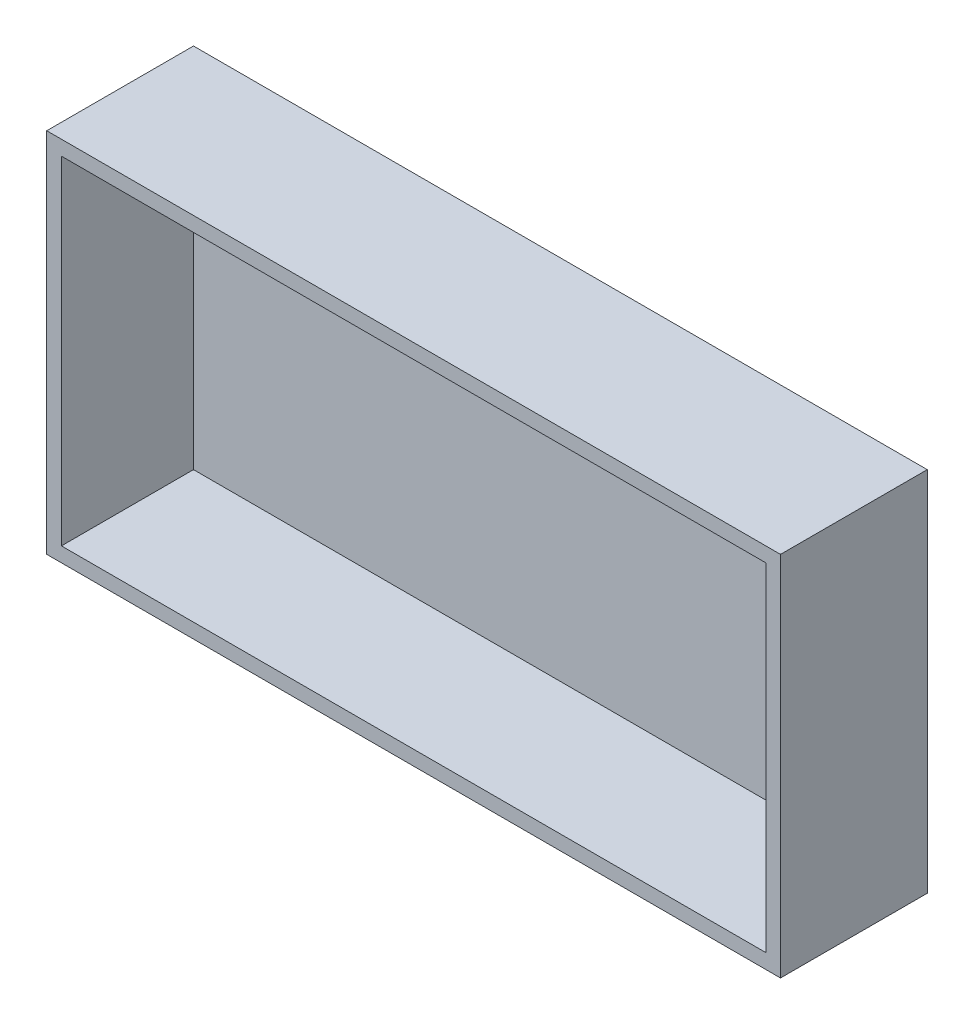
ISO-10303-21;
HEADER;
FILE_DESCRIPTION(('STEP AP214'),'2;1');
FILE_NAME('part.step','',(''),(''),'','','');
FILE_SCHEMA(('AUTOMOTIVE_DESIGN { 1 0 10303 214 1 1 1 1 }'));
ENDSEC;
DATA;
#1=APPLICATION_CONTEXT('core data for automotive mechanical design processes');
#2=APPLICATION_PROTOCOL_DEFINITION('international standard','automotive_design',2000,#1);
#3=PRODUCT_CONTEXT('',#1,'mechanical');
#4=PRODUCT('Part','Part','',(#3));
#5=PRODUCT_RELATED_PRODUCT_CATEGORY('part','',(#4));
#6=PRODUCT_DEFINITION_FORMATION('','',#4);
#7=PRODUCT_DEFINITION_CONTEXT('part definition',#1,'design');
#8=PRODUCT_DEFINITION('design','',#6,#7);
#9=PRODUCT_DEFINITION_SHAPE('','',#8);
#10=(LENGTH_UNIT() NAMED_UNIT(*) SI_UNIT(.MILLI.,.METRE.));
#11=(NAMED_UNIT(*) PLANE_ANGLE_UNIT() SI_UNIT($,.RADIAN.));
#12=(NAMED_UNIT(*) SI_UNIT($,.STERADIAN.) SOLID_ANGLE_UNIT());
#13=UNCERTAINTY_MEASURE_WITH_UNIT(LENGTH_MEASURE(1.E-05),#10,'distance_accuracy_value','');
#14=(GEOMETRIC_REPRESENTATION_CONTEXT(3) GLOBAL_UNCERTAINTY_ASSIGNED_CONTEXT((#13)) GLOBAL_UNIT_ASSIGNED_CONTEXT((#10,
#11,#12)) REPRESENTATION_CONTEXT('',''));
#15=CARTESIAN_POINT('',(0.,0.,0.));
#16=DIRECTION('',(0.,0.,1.));
#17=DIRECTION('',(1.,0.,0.));
#18=AXIS2_PLACEMENT_3D('',#15,#16,#17);
#19=CARTESIAN_POINT('',(3.,55.,20.));
#20=DIRECTION('',(1.,0.,0.));
#21=DIRECTION('',(0.,0.,-1.));
#22=AXIS2_PLACEMENT_3D('',#19,#20,#21);
#23=PLANE('',#22);
#24=DIRECTION('',(0.,-1.,0.));
#25=VECTOR('',#24,1.);
#26=CARTESIAN_POINT('',(3.,55.,0.));
#27=LINE('',#26,#25);
#28=CARTESIAN_POINT('',(3.,55.,0.));
#29=VERTEX_POINT('',#28);
#30=CARTESIAN_POINT('',(3.,5.,0.));
#31=VERTEX_POINT('',#30);
#32=EDGE_CURVE('E155',#29,#31,#27,.T.);
#33=ORIENTED_EDGE('',*,*,#32,.T.);
#34=DIRECTION('',(0.,0.,-1.));
#35=VECTOR('',#34,1.);
#36=CARTESIAN_POINT('',(3.,5.,20.));
#37=LINE('',#36,#35);
#38=CARTESIAN_POINT('',(3.,5.,20.));
#39=VERTEX_POINT('',#38);
#40=EDGE_CURVE('E11',#39,#31,#37,.T.);
#41=ORIENTED_EDGE('',*,*,#40,.F.);
#42=DIRECTION('',(0.,-1.,0.));
#43=VECTOR('',#42,1.);
#44=CARTESIAN_POINT('',(3.,55.,20.));
#45=LINE('',#44,#43);
#46=CARTESIAN_POINT('',(3.,55.,20.));
#47=VERTEX_POINT('',#46);
#48=EDGE_CURVE('E148',#47,#39,#45,.T.);
#49=ORIENTED_EDGE('',*,*,#48,.F.);
#50=DIRECTION('',(0.,0.,-1.));
#51=VECTOR('',#50,1.);
#52=CARTESIAN_POINT('',(3.,55.,20.));
#53=LINE('',#52,#51);
#54=EDGE_CURVE('E154',#47,#29,#53,.T.);
#55=ORIENTED_EDGE('',*,*,#54,.T.);
#56=EDGE_LOOP('',(#33,#41,#49,#55));
#57=FACE_BOUND('',#56,.T.);
#58=ADVANCED_FACE('F41',(#57),#23,.F.);
#59=CARTESIAN_POINT('',(3.,5.,20.));
#60=DIRECTION('',(0.,1.,0.));
#61=DIRECTION('',(0.,0.,1.));
#62=AXIS2_PLACEMENT_3D('',#59,#60,#61);
#63=PLANE('',#62);
#64=DIRECTION('',(1.,0.,0.));
#65=VECTOR('',#64,1.);
#66=CARTESIAN_POINT('',(3.,5.,0.));
#67=LINE('',#66,#65);
#68=CARTESIAN_POINT('',(103.,5.,0.));
#69=VERTEX_POINT('',#68);
#70=EDGE_CURVE('E158',#31,#69,#67,.T.);
#71=ORIENTED_EDGE('',*,*,#70,.T.);
#72=DIRECTION('',(0.,0.,-1.));
#73=VECTOR('',#72,1.);
#74=CARTESIAN_POINT('',(103.,5.,20.));
#75=LINE('',#74,#73);
#76=CARTESIAN_POINT('',(103.,5.,20.));
#77=VERTEX_POINT('',#76);
#78=EDGE_CURVE('E48',#77,#69,#75,.T.);
#79=ORIENTED_EDGE('',*,*,#78,.F.);
#80=DIRECTION('',(1.,0.,0.));
#81=VECTOR('',#80,1.);
#82=CARTESIAN_POINT('',(3.,5.,20.));
#83=LINE('',#82,#81);
#84=EDGE_CURVE('E92',#39,#77,#83,.T.);
#85=ORIENTED_EDGE('',*,*,#84,.F.);
#86=ORIENTED_EDGE('',*,*,#40,.T.);
#87=EDGE_LOOP('',(#71,#79,#85,#86));
#88=FACE_BOUND('',#87,.T.);
#89=ADVANCED_FACE('F188',(#88),#63,.F.);
#90=CARTESIAN_POINT('',(103.,5.,20.));
#91=DIRECTION('',(-1.,0.,0.));
#92=DIRECTION('',(0.,0.,1.));
#93=AXIS2_PLACEMENT_3D('',#90,#91,#92);
#94=PLANE('',#93);
#95=DIRECTION('',(0.,1.,0.));
#96=VECTOR('',#95,1.);
#97=CARTESIAN_POINT('',(103.,5.,0.));
#98=LINE('',#97,#96);
#99=CARTESIAN_POINT('',(103.,55.,0.));
#100=VERTEX_POINT('',#99);
#101=EDGE_CURVE('E160',#69,#100,#98,.T.);
#102=ORIENTED_EDGE('',*,*,#101,.T.);
#103=DIRECTION('',(0.,0.,-1.));
#104=VECTOR('',#103,1.);
#105=CARTESIAN_POINT('',(103.,55.,20.));
#106=LINE('',#105,#104);
#107=CARTESIAN_POINT('',(103.,55.,20.));
#108=VERTEX_POINT('',#107);
#109=EDGE_CURVE('E164',#108,#100,#106,.T.);
#110=ORIENTED_EDGE('',*,*,#109,.F.);
#111=DIRECTION('',(0.,1.,0.));
#112=VECTOR('',#111,1.);
#113=CARTESIAN_POINT('',(103.,5.,20.));
#114=LINE('',#113,#112);
#115=EDGE_CURVE('E151',#77,#108,#114,.T.);
#116=ORIENTED_EDGE('',*,*,#115,.F.);
#117=ORIENTED_EDGE('',*,*,#78,.T.);
#118=EDGE_LOOP('',(#102,#110,#116,#117));
#119=FACE_BOUND('',#118,.T.);
#120=ADVANCED_FACE('F169',(#119),#94,.F.);
#121=CARTESIAN_POINT('',(103.,55.,20.));
#122=DIRECTION('',(0.,-1.,0.));
#123=DIRECTION('',(0.,0.,-1.));
#124=AXIS2_PLACEMENT_3D('',#121,#122,#123);
#125=PLANE('',#124);
#126=DIRECTION('',(-1.,0.,0.));
#127=VECTOR('',#126,1.);
#128=CARTESIAN_POINT('',(103.,55.,0.));
#129=LINE('',#128,#127);
#130=EDGE_CURVE('E85',#100,#29,#129,.T.);
#131=ORIENTED_EDGE('',*,*,#130,.T.);
#132=ORIENTED_EDGE('',*,*,#54,.F.);
#133=DIRECTION('',(-1.,0.,0.));
#134=VECTOR('',#133,1.);
#135=CARTESIAN_POINT('',(103.,55.,20.));
#136=LINE('',#135,#134);
#137=EDGE_CURVE('E64',#108,#47,#136,.T.);
#138=ORIENTED_EDGE('',*,*,#137,.F.);
#139=ORIENTED_EDGE('',*,*,#109,.T.);
#140=EDGE_LOOP('',(#131,#132,#138,#139));
#141=FACE_BOUND('',#140,.T.);
#142=ADVANCED_FACE('F177',(#141),#125,.F.);
#143=CARTESIAN_POINT('',(0.,0.,20.));
#144=DIRECTION('',(0.,0.,1.));
#145=DIRECTION('',(1.,0.,0.));
#146=AXIS2_PLACEMENT_3D('',#143,#144,#145);
#147=PLANE('',#146);
#148=DIRECTION('',(0.,-1.,0.));
#149=VECTOR('',#148,1.);
#150=CARTESIAN_POINT('',(5.,55.,20.));
#151=LINE('',#150,#149);
#152=CARTESIAN_POINT('',(5.,53.,20.));
#153=VERTEX_POINT('',#152);
#154=CARTESIAN_POINT('',(5.,7.,20.));
#155=VERTEX_POINT('',#154);
#156=EDGE_CURVE('E137',#153,#155,#151,.T.);
#157=ORIENTED_EDGE('',*,*,#156,.F.);
#158=DIRECTION('',(-1.,0.,0.));
#159=VECTOR('',#158,1.);
#160=CARTESIAN_POINT('',(103.,53.,20.));
#161=LINE('',#160,#159);
#162=CARTESIAN_POINT('',(101.,53.,20.));
#163=VERTEX_POINT('',#162);
#164=EDGE_CURVE('E146',#163,#153,#161,.T.);
#165=ORIENTED_EDGE('',*,*,#164,.F.);
#166=DIRECTION('',(0.,1.,0.));
#167=VECTOR('',#166,1.);
#168=CARTESIAN_POINT('',(101.,5.,20.));
#169=LINE('',#168,#167);
#170=CARTESIAN_POINT('',(101.,7.,20.));
#171=VERTEX_POINT('',#170);
#172=EDGE_CURVE('E144',#171,#163,#169,.T.);
#173=ORIENTED_EDGE('',*,*,#172,.F.);
#174=DIRECTION('',(1.,0.,0.));
#175=VECTOR('',#174,1.);
#176=CARTESIAN_POINT('',(3.,7.,20.));
#177=LINE('',#176,#175);
#178=EDGE_CURVE('E129',#155,#171,#177,.T.);
#179=ORIENTED_EDGE('',*,*,#178,.F.);
#180=EDGE_LOOP('',(#157,#165,#173,#179));
#181=FACE_BOUND('',#180,.T.);
#182=ORIENTED_EDGE('',*,*,#48,.T.);
#183=ORIENTED_EDGE('',*,*,#84,.T.);
#184=ORIENTED_EDGE('',*,*,#115,.T.);
#185=ORIENTED_EDGE('',*,*,#137,.T.);
#186=EDGE_LOOP('',(#182,#183,#184,#185));
#187=FACE_BOUND('',#186,.T.);
#188=ADVANCED_FACE('F179',(#181,#187),#147,.T.);
#189=CARTESIAN_POINT('',(0.,0.,0.));
#190=DIRECTION('',(0.,0.,1.));
#191=DIRECTION('',(1.,0.,0.));
#192=AXIS2_PLACEMENT_3D('',#189,#190,#191);
#193=PLANE('',#192);
#194=ORIENTED_EDGE('',*,*,#32,.F.);
#195=ORIENTED_EDGE('',*,*,#130,.F.);
#196=ORIENTED_EDGE('',*,*,#101,.F.);
#197=ORIENTED_EDGE('',*,*,#70,.F.);
#198=EDGE_LOOP('',(#194,#195,#196,#197));
#199=FACE_BOUND('',#198,.T.);
#200=ADVANCED_FACE('F173',(#199),#193,.F.);
#201=CARTESIAN_POINT('',(5.,55.,20.));
#202=DIRECTION('',(1.,0.,0.));
#203=DIRECTION('',(0.,0.,-1.));
#204=AXIS2_PLACEMENT_3D('',#201,#202,#203);
#205=PLANE('',#204);
#206=DIRECTION('',(0.,-1.,0.));
#207=VECTOR('',#206,1.);
#208=CARTESIAN_POINT('',(5.,55.,2.));
#209=LINE('',#208,#207);
#210=CARTESIAN_POINT('',(5.,53.,2.));
#211=VERTEX_POINT('',#210);
#212=CARTESIAN_POINT('',(5.,7.,2.));
#213=VERTEX_POINT('',#212);
#214=EDGE_CURVE('E120',#211,#213,#209,.T.);
#215=ORIENTED_EDGE('',*,*,#214,.F.);
#216=DIRECTION('',(0.,0.,-1.));
#217=VECTOR('',#216,1.);
#218=CARTESIAN_POINT('',(5.,53.,20.));
#219=LINE('',#218,#217);
#220=EDGE_CURVE('E140',#153,#211,#219,.T.);
#221=ORIENTED_EDGE('',*,*,#220,.F.);
#222=ORIENTED_EDGE('',*,*,#156,.T.);
#223=DIRECTION('',(0.,0.,-1.));
#224=VECTOR('',#223,1.);
#225=CARTESIAN_POINT('',(5.,7.,20.));
#226=LINE('',#225,#224);
#227=EDGE_CURVE('E132',#155,#213,#226,.T.);
#228=ORIENTED_EDGE('',*,*,#227,.T.);
#229=EDGE_LOOP('',(#215,#221,#222,#228));
#230=FACE_BOUND('',#229,.T.);
#231=ADVANCED_FACE('F222',(#230),#205,.T.);
#232=CARTESIAN_POINT('',(3.,7.,20.));
#233=DIRECTION('',(0.,1.,0.));
#234=DIRECTION('',(0.,0.,1.));
#235=AXIS2_PLACEMENT_3D('',#232,#233,#234);
#236=PLANE('',#235);
#237=DIRECTION('',(1.,0.,0.));
#238=VECTOR('',#237,1.);
#239=CARTESIAN_POINT('',(3.,7.,2.));
#240=LINE('',#239,#238);
#241=CARTESIAN_POINT('',(101.,7.,2.));
#242=VERTEX_POINT('',#241);
#243=EDGE_CURVE('E114',#213,#242,#240,.T.);
#244=ORIENTED_EDGE('',*,*,#243,.F.);
#245=ORIENTED_EDGE('',*,*,#227,.F.);
#246=ORIENTED_EDGE('',*,*,#178,.T.);
#247=DIRECTION('',(0.,0.,-1.));
#248=VECTOR('',#247,1.);
#249=CARTESIAN_POINT('',(101.,7.,20.));
#250=LINE('',#249,#248);
#251=EDGE_CURVE('E126',#171,#242,#250,.T.);
#252=ORIENTED_EDGE('',*,*,#251,.T.);
#253=EDGE_LOOP('',(#244,#245,#246,#252));
#254=FACE_BOUND('',#253,.T.);
#255=ADVANCED_FACE('F127',(#254),#236,.T.);
#256=CARTESIAN_POINT('',(101.,5.,20.));
#257=DIRECTION('',(-1.,0.,0.));
#258=DIRECTION('',(0.,0.,1.));
#259=AXIS2_PLACEMENT_3D('',#256,#257,#258);
#260=PLANE('',#259);
#261=DIRECTION('',(0.,1.,0.));
#262=VECTOR('',#261,1.);
#263=CARTESIAN_POINT('',(101.,5.,2.));
#264=LINE('',#263,#262);
#265=CARTESIAN_POINT('',(101.,53.,2.));
#266=VERTEX_POINT('',#265);
#267=EDGE_CURVE('E118',#242,#266,#264,.T.);
#268=ORIENTED_EDGE('',*,*,#267,.F.);
#269=ORIENTED_EDGE('',*,*,#251,.F.);
#270=ORIENTED_EDGE('',*,*,#172,.T.);
#271=DIRECTION('',(0.,0.,-1.));
#272=VECTOR('',#271,1.);
#273=CARTESIAN_POINT('',(101.,53.,20.));
#274=LINE('',#273,#272);
#275=EDGE_CURVE('E55',#163,#266,#274,.T.);
#276=ORIENTED_EDGE('',*,*,#275,.T.);
#277=EDGE_LOOP('',(#268,#269,#270,#276));
#278=FACE_BOUND('',#277,.T.);
#279=ADVANCED_FACE('F134',(#278),#260,.T.);
#280=CARTESIAN_POINT('',(103.,53.,20.));
#281=DIRECTION('',(0.,-1.,0.));
#282=DIRECTION('',(0.,0.,-1.));
#283=AXIS2_PLACEMENT_3D('',#280,#281,#282);
#284=PLANE('',#283);
#285=DIRECTION('',(-1.,0.,0.));
#286=VECTOR('',#285,1.);
#287=CARTESIAN_POINT('',(103.,53.,2.));
#288=LINE('',#287,#286);
#289=EDGE_CURVE('E135',#266,#211,#288,.T.);
#290=ORIENTED_EDGE('',*,*,#289,.F.);
#291=ORIENTED_EDGE('',*,*,#275,.F.);
#292=ORIENTED_EDGE('',*,*,#164,.T.);
#293=ORIENTED_EDGE('',*,*,#220,.T.);
#294=EDGE_LOOP('',(#290,#291,#292,#293));
#295=FACE_BOUND('',#294,.T.);
#296=ADVANCED_FACE('F246',(#295),#284,.T.);
#297=CARTESIAN_POINT('',(0.,0.,2.));
#298=DIRECTION('',(0.,0.,1.));
#299=DIRECTION('',(1.,0.,0.));
#300=AXIS2_PLACEMENT_3D('',#297,#298,#299);
#301=PLANE('',#300);
#302=ORIENTED_EDGE('',*,*,#214,.T.);
#303=ORIENTED_EDGE('',*,*,#243,.T.);
#304=ORIENTED_EDGE('',*,*,#267,.T.);
#305=ORIENTED_EDGE('',*,*,#289,.T.);
#306=EDGE_LOOP('',(#302,#303,#304,#305));
#307=FACE_BOUND('',#306,.T.);
#308=ADVANCED_FACE('F116',(#307),#301,.T.);
#309=CLOSED_SHELL('',(#58,#89,#120,#142,#188,#200,#231,#255,#279,#296,#308));
#310=MANIFOLD_SOLID_BREP('B2',#309);
#311=ADVANCED_BREP_SHAPE_REPRESENTATION('',(#18,#310),#14);
#312=SHAPE_DEFINITION_REPRESENTATION(#9,#311);
ENDSEC;
END-ISO-10303-21;
